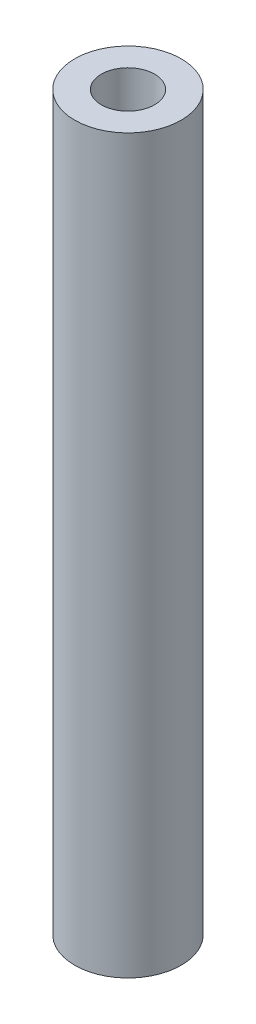
ISO-10303-21;
HEADER;
FILE_DESCRIPTION(('STEP AP214'),'2;1');
FILE_NAME('part.step','',(''),(''),'','','');
FILE_SCHEMA(('AUTOMOTIVE_DESIGN { 1 0 10303 214 1 1 1 1 }'));
ENDSEC;
DATA;
#1=APPLICATION_CONTEXT('core data for automotive mechanical design processes');
#2=APPLICATION_PROTOCOL_DEFINITION('international standard','automotive_design',2000,#1);
#3=PRODUCT_CONTEXT('',#1,'mechanical');
#4=PRODUCT('Part','Part','',(#3));
#5=PRODUCT_RELATED_PRODUCT_CATEGORY('part','',(#4));
#6=PRODUCT_DEFINITION_FORMATION('','',#4);
#7=PRODUCT_DEFINITION_CONTEXT('part definition',#1,'design');
#8=PRODUCT_DEFINITION('design','',#6,#7);
#9=PRODUCT_DEFINITION_SHAPE('','',#8);
#10=(LENGTH_UNIT() NAMED_UNIT(*) SI_UNIT(.MILLI.,.METRE.));
#11=(NAMED_UNIT(*) PLANE_ANGLE_UNIT() SI_UNIT($,.RADIAN.));
#12=(NAMED_UNIT(*) SI_UNIT($,.STERADIAN.) SOLID_ANGLE_UNIT());
#13=UNCERTAINTY_MEASURE_WITH_UNIT(LENGTH_MEASURE(1.E-05),#10,'distance_accuracy_value','');
#14=(GEOMETRIC_REPRESENTATION_CONTEXT(3) GLOBAL_UNCERTAINTY_ASSIGNED_CONTEXT((#13)) GLOBAL_UNIT_ASSIGNED_CONTEXT((#10,
#11,#12)) REPRESENTATION_CONTEXT('',''));
#15=CARTESIAN_POINT('',(0.,0.,0.));
#16=DIRECTION('',(0.,0.,1.));
#17=DIRECTION('',(1.,0.,0.));
#18=AXIS2_PLACEMENT_3D('',#15,#16,#17);
#19=CARTESIAN_POINT('',(0.,17.4625,0.));
#20=DIRECTION('',(0.,1.,0.));
#21=DIRECTION('',(0.,0.,1.));
#22=AXIS2_PLACEMENT_3D('',#19,#20,#21);
#23=PLANE('',#22);
#24=CARTESIAN_POINT('',(0.,17.4625,0.));
#25=DIRECTION('',(0.,1.,0.));
#26=DIRECTION('',(0.,0.,1.));
#27=AXIS2_PLACEMENT_3D('',#24,#25,#26);
#28=CIRCLE('',#27,2.54);
#29=CARTESIAN_POINT('',(0.,17.4625,2.54));
#30=VERTEX_POINT('',#29);
#31=EDGE_CURVE('E10',#30,#30,#28,.T.);
#32=ORIENTED_EDGE('',*,*,#31,.T.);
#33=EDGE_LOOP('',(#32));
#34=FACE_BOUND('',#33,.T.);
#35=CARTESIAN_POINT('',(0.,17.4625,0.));
#36=DIRECTION('',(0.,1.,0.));
#37=DIRECTION('',(0.,0.,1.));
#38=AXIS2_PLACEMENT_3D('',#35,#36,#37);
#39=CIRCLE('',#38,1.27);
#40=CARTESIAN_POINT('',(0.,17.4625,1.27));
#41=VERTEX_POINT('',#40);
#42=EDGE_CURVE('E53',#41,#41,#39,.T.);
#43=ORIENTED_EDGE('',*,*,#42,.F.);
#44=EDGE_LOOP('',(#43));
#45=FACE_BOUND('',#44,.T.);
#46=ADVANCED_FACE('F39',(#34,#45),#23,.T.);
#47=CARTESIAN_POINT('',(0.,-17.4625,0.));
#48=DIRECTION('',(0.,1.,0.));
#49=DIRECTION('',(0.,0.,1.));
#50=AXIS2_PLACEMENT_3D('',#47,#48,#49);
#51=PLANE('',#50);
#52=CARTESIAN_POINT('',(0.,-17.4625,0.));
#53=DIRECTION('',(0.,1.,0.));
#54=DIRECTION('',(0.,0.,1.));
#55=AXIS2_PLACEMENT_3D('',#52,#53,#54);
#56=CIRCLE('',#55,2.54);
#57=CARTESIAN_POINT('',(0.,-17.4625,2.54));
#58=VERTEX_POINT('',#57);
#59=EDGE_CURVE('E43',#58,#58,#56,.T.);
#60=ORIENTED_EDGE('',*,*,#59,.F.);
#61=EDGE_LOOP('',(#60));
#62=FACE_BOUND('',#61,.T.);
#63=CARTESIAN_POINT('',(0.,-17.4625,0.));
#64=DIRECTION('',(0.,1.,0.));
#65=DIRECTION('',(0.,0.,1.));
#66=AXIS2_PLACEMENT_3D('',#63,#64,#65);
#67=CIRCLE('',#66,1.27);
#68=CARTESIAN_POINT('',(0.,-17.4625,1.27));
#69=VERTEX_POINT('',#68);
#70=EDGE_CURVE('E55',#69,#69,#67,.T.);
#71=ORIENTED_EDGE('',*,*,#70,.T.);
#72=EDGE_LOOP('',(#71));
#73=FACE_BOUND('',#72,.T.);
#74=ADVANCED_FACE('F66',(#62,#73),#51,.F.);
#75=CARTESIAN_POINT('',(0.,17.4625,0.));
#76=DIRECTION('',(0.,-1.,0.));
#77=DIRECTION('',(0.,0.,-1.));
#78=AXIS2_PLACEMENT_3D('',#75,#76,#77);
#79=CYLINDRICAL_SURFACE('',#78,2.54);
#80=ORIENTED_EDGE('',*,*,#31,.F.);
#81=EDGE_LOOP('',(#80));
#82=FACE_BOUND('',#81,.T.);
#83=ORIENTED_EDGE('',*,*,#59,.T.);
#84=EDGE_LOOP('',(#83));
#85=FACE_BOUND('',#84,.T.);
#86=ADVANCED_FACE('F41',(#82,#85),#79,.T.);
#87=CARTESIAN_POINT('',(0.,17.4625,0.));
#88=DIRECTION('',(0.,-1.,0.));
#89=DIRECTION('',(0.,0.,-1.));
#90=AXIS2_PLACEMENT_3D('',#87,#88,#89);
#91=CYLINDRICAL_SURFACE('',#90,1.27);
#92=ORIENTED_EDGE('',*,*,#42,.T.);
#93=EDGE_LOOP('',(#92));
#94=FACE_BOUND('',#93,.T.);
#95=ORIENTED_EDGE('',*,*,#70,.F.);
#96=EDGE_LOOP('',(#95));
#97=FACE_BOUND('',#96,.T.);
#98=ADVANCED_FACE('F62',(#94,#97),#91,.F.);
#99=CLOSED_SHELL('',(#46,#74,#86,#98));
#100=MANIFOLD_SOLID_BREP('B2',#99);
#101=ADVANCED_BREP_SHAPE_REPRESENTATION('',(#18,#100),#14);
#102=SHAPE_DEFINITION_REPRESENTATION(#9,#101);
ENDSEC;
END-ISO-10303-21;
